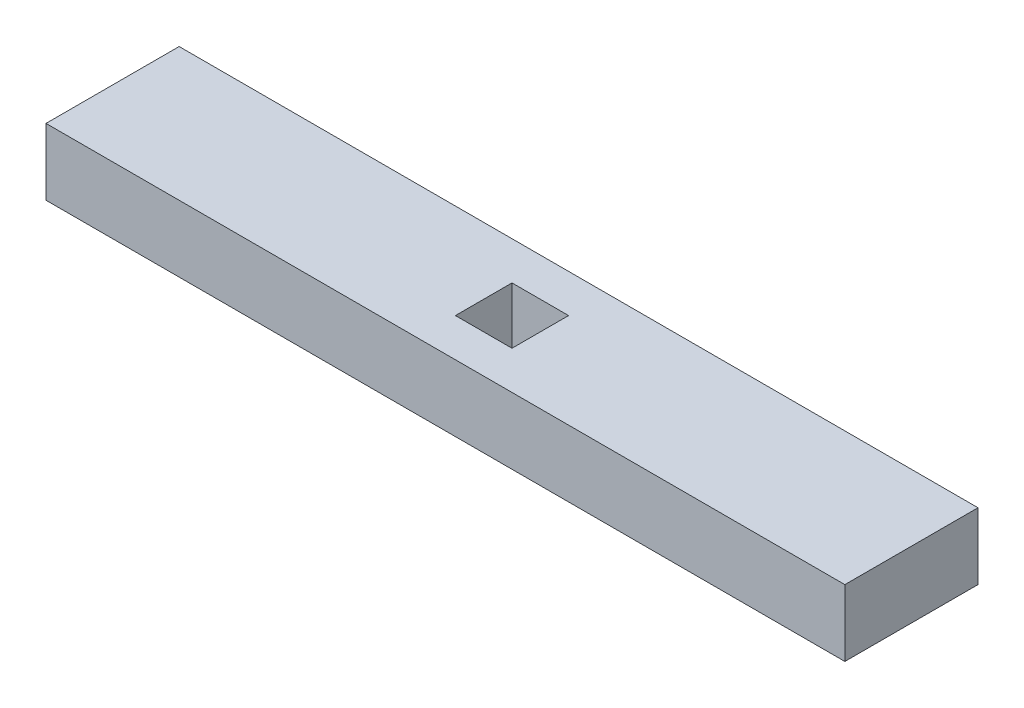
ISO-10303-21;
HEADER;
FILE_DESCRIPTION(('STEP AP214'),'2;1');
FILE_NAME('part.step','',(''),(''),'','','');
FILE_SCHEMA(('AUTOMOTIVE_DESIGN { 1 0 10303 214 1 1 1 1 }'));
ENDSEC;
DATA;
#1=APPLICATION_CONTEXT('core data for automotive mechanical design processes');
#2=APPLICATION_PROTOCOL_DEFINITION('international standard','automotive_design',2000,#1);
#3=PRODUCT_CONTEXT('',#1,'mechanical');
#4=PRODUCT('Part','Part','',(#3));
#5=PRODUCT_RELATED_PRODUCT_CATEGORY('part','',(#4));
#6=PRODUCT_DEFINITION_FORMATION('','',#4);
#7=PRODUCT_DEFINITION_CONTEXT('part definition',#1,'design');
#8=PRODUCT_DEFINITION('design','',#6,#7);
#9=PRODUCT_DEFINITION_SHAPE('','',#8);
#10=(LENGTH_UNIT() NAMED_UNIT(*) SI_UNIT(.MILLI.,.METRE.));
#11=(NAMED_UNIT(*) PLANE_ANGLE_UNIT() SI_UNIT($,.RADIAN.));
#12=(NAMED_UNIT(*) SI_UNIT($,.STERADIAN.) SOLID_ANGLE_UNIT());
#13=UNCERTAINTY_MEASURE_WITH_UNIT(LENGTH_MEASURE(1.E-05),#10,'distance_accuracy_value','');
#14=(GEOMETRIC_REPRESENTATION_CONTEXT(3) GLOBAL_UNCERTAINTY_ASSIGNED_CONTEXT((#13)) GLOBAL_UNIT_ASSIGNED_CONTEXT((#10,
#11,#12)) REPRESENTATION_CONTEXT('',''));
#15=CARTESIAN_POINT('',(0.,0.,0.));
#16=DIRECTION('',(0.,0.,1.));
#17=DIRECTION('',(1.,0.,0.));
#18=AXIS2_PLACEMENT_3D('',#15,#16,#17);
#19=CARTESIAN_POINT('',(0.,5.,0.));
#20=DIRECTION('',(0.,-1.,0.));
#21=DIRECTION('',(0.,0.,-1.));
#22=AXIS2_PLACEMENT_3D('',#19,#20,#21);
#23=PLANE('',#22);
#24=DIRECTION('',(0.,0.,1.));
#25=VECTOR('',#24,1.);
#26=CARTESIAN_POINT('',(-30.0000000000003,5.,-5.));
#27=LINE('',#26,#25);
#28=CARTESIAN_POINT('',(-30.0000000000003,5.,-5.));
#29=VERTEX_POINT('',#28);
#30=CARTESIAN_POINT('',(-30.0000000000003,5.,5.00000000000005));
#31=VERTEX_POINT('',#30);
#32=EDGE_CURVE('E136',#29,#31,#27,.T.);
#33=ORIENTED_EDGE('',*,*,#32,.T.);
#34=DIRECTION('',(1.,0.,0.));
#35=VECTOR('',#34,1.);
#36=CARTESIAN_POINT('',(30.,5.,5.00000000000005));
#37=LINE('',#36,#35);
#38=CARTESIAN_POINT('',(30.,5.,5.00000000000005));
#39=VERTEX_POINT('',#38);
#40=EDGE_CURVE('E139',#31,#39,#37,.T.);
#41=ORIENTED_EDGE('',*,*,#40,.T.);
#42=DIRECTION('',(0.,0.,-1.));
#43=VECTOR('',#42,1.);
#44=CARTESIAN_POINT('',(30.,5.,-5.));
#45=LINE('',#44,#43);
#46=CARTESIAN_POINT('',(30.,5.,-5.));
#47=VERTEX_POINT('',#46);
#48=EDGE_CURVE('E142',#39,#47,#45,.T.);
#49=ORIENTED_EDGE('',*,*,#48,.T.);
#50=DIRECTION('',(-1.,0.,0.));
#51=VECTOR('',#50,1.);
#52=CARTESIAN_POINT('',(30.,5.,-5.));
#53=LINE('',#52,#51);
#54=EDGE_CURVE('E144',#47,#29,#53,.T.);
#55=ORIENTED_EDGE('',*,*,#54,.T.);
#56=EDGE_LOOP('',(#33,#41,#49,#55));
#57=FACE_BOUND('',#56,.T.);
#58=DIRECTION('',(0.,0.,1.));
#59=VECTOR('',#58,1.);
#60=CARTESIAN_POINT('',(-2.125,5.,-2.125));
#61=LINE('',#60,#59);
#62=CARTESIAN_POINT('',(-2.125,5.,-2.125));
#63=VERTEX_POINT('',#62);
#64=CARTESIAN_POINT('',(-2.125,5.,2.125));
#65=VERTEX_POINT('',#64);
#66=EDGE_CURVE('E100',#63,#65,#61,.T.);
#67=ORIENTED_EDGE('',*,*,#66,.F.);
#68=DIRECTION('',(-1.,0.,0.));
#69=VECTOR('',#68,1.);
#70=CARTESIAN_POINT('',(2.125,5.,-2.125));
#71=LINE('',#70,#69);
#72=CARTESIAN_POINT('',(2.125,5.,-2.125));
#73=VERTEX_POINT('',#72);
#74=EDGE_CURVE('E122',#73,#63,#71,.T.);
#75=ORIENTED_EDGE('',*,*,#74,.F.);
#76=DIRECTION('',(0.,0.,-1.));
#77=VECTOR('',#76,1.);
#78=CARTESIAN_POINT('',(2.125,5.,-2.125));
#79=LINE('',#78,#77);
#80=CARTESIAN_POINT('',(2.125,5.,2.125));
#81=VERTEX_POINT('',#80);
#82=EDGE_CURVE('E120',#81,#73,#79,.T.);
#83=ORIENTED_EDGE('',*,*,#82,.F.);
#84=DIRECTION('',(1.,0.,0.));
#85=VECTOR('',#84,1.);
#86=CARTESIAN_POINT('',(2.125,5.,2.125));
#87=LINE('',#86,#85);
#88=EDGE_CURVE('E108',#65,#81,#87,.T.);
#89=ORIENTED_EDGE('',*,*,#88,.F.);
#90=EDGE_LOOP('',(#67,#75,#83,#89));
#91=FACE_BOUND('',#90,.T.);
#92=ADVANCED_FACE('F35',(#57,#91),#23,.F.);
#93=CARTESIAN_POINT('',(0.,0.,0.));
#94=DIRECTION('',(0.,-1.,0.));
#95=DIRECTION('',(0.,0.,-1.));
#96=AXIS2_PLACEMENT_3D('',#93,#94,#95);
#97=PLANE('',#96);
#98=DIRECTION('',(0.,0.,1.));
#99=VECTOR('',#98,1.);
#100=CARTESIAN_POINT('',(-30.0000000000003,0.,-5.));
#101=LINE('',#100,#99);
#102=CARTESIAN_POINT('',(-30.0000000000003,0.,-5.));
#103=VERTEX_POINT('',#102);
#104=CARTESIAN_POINT('',(-30.0000000000003,0.,5.00000000000005));
#105=VERTEX_POINT('',#104);
#106=EDGE_CURVE('E116',#103,#105,#101,.T.);
#107=ORIENTED_EDGE('',*,*,#106,.F.);
#108=DIRECTION('',(-1.,0.,0.));
#109=VECTOR('',#108,1.);
#110=CARTESIAN_POINT('',(30.,0.,-5.));
#111=LINE('',#110,#109);
#112=CARTESIAN_POINT('',(30.,0.,-5.));
#113=VERTEX_POINT('',#112);
#114=EDGE_CURVE('E140',#113,#103,#111,.T.);
#115=ORIENTED_EDGE('',*,*,#114,.F.);
#116=DIRECTION('',(0.,0.,-1.));
#117=VECTOR('',#116,1.);
#118=CARTESIAN_POINT('',(30.,0.,-5.));
#119=LINE('',#118,#117);
#120=CARTESIAN_POINT('',(30.,0.,5.00000000000005));
#121=VERTEX_POINT('',#120);
#122=EDGE_CURVE('E151',#121,#113,#119,.T.);
#123=ORIENTED_EDGE('',*,*,#122,.F.);
#124=DIRECTION('',(1.,0.,0.));
#125=VECTOR('',#124,1.);
#126=CARTESIAN_POINT('',(30.,0.,5.00000000000005));
#127=LINE('',#126,#125);
#128=EDGE_CURVE('E149',#105,#121,#127,.T.);
#129=ORIENTED_EDGE('',*,*,#128,.F.);
#130=EDGE_LOOP('',(#107,#115,#123,#129));
#131=FACE_BOUND('',#130,.T.);
#132=DIRECTION('',(-1.,0.,0.));
#133=VECTOR('',#132,1.);
#134=CARTESIAN_POINT('',(2.125,0.,-2.125));
#135=LINE('',#134,#133);
#136=CARTESIAN_POINT('',(2.125,0.,-2.125));
#137=VERTEX_POINT('',#136);
#138=CARTESIAN_POINT('',(-2.125,0.,-2.125));
#139=VERTEX_POINT('',#138);
#140=EDGE_CURVE('E109',#137,#139,#135,.T.);
#141=ORIENTED_EDGE('',*,*,#140,.T.);
#142=DIRECTION('',(0.,0.,1.));
#143=VECTOR('',#142,1.);
#144=CARTESIAN_POINT('',(-2.125,0.,-2.125));
#145=LINE('',#144,#143);
#146=CARTESIAN_POINT('',(-2.125,0.,2.125));
#147=VERTEX_POINT('',#146);
#148=EDGE_CURVE('E58',#139,#147,#145,.T.);
#149=ORIENTED_EDGE('',*,*,#148,.T.);
#150=DIRECTION('',(1.,0.,0.));
#151=VECTOR('',#150,1.);
#152=CARTESIAN_POINT('',(2.125,0.,2.125));
#153=LINE('',#152,#151);
#154=CARTESIAN_POINT('',(2.125,0.,2.125));
#155=VERTEX_POINT('',#154);
#156=EDGE_CURVE('E115',#147,#155,#153,.T.);
#157=ORIENTED_EDGE('',*,*,#156,.T.);
#158=DIRECTION('',(0.,0.,-1.));
#159=VECTOR('',#158,1.);
#160=CARTESIAN_POINT('',(2.125,0.,-2.125));
#161=LINE('',#160,#159);
#162=EDGE_CURVE('E128',#155,#137,#161,.T.);
#163=ORIENTED_EDGE('',*,*,#162,.T.);
#164=EDGE_LOOP('',(#141,#149,#157,#163));
#165=FACE_BOUND('',#164,.T.);
#166=ADVANCED_FACE('F169',(#131,#165),#97,.T.);
#167=CARTESIAN_POINT('',(-30.0000000000003,5.,-5.));
#168=DIRECTION('',(1.,0.,0.));
#169=DIRECTION('',(0.,0.,-1.));
#170=AXIS2_PLACEMENT_3D('',#167,#168,#169);
#171=PLANE('',#170);
#172=ORIENTED_EDGE('',*,*,#106,.T.);
#173=DIRECTION('',(0.,-1.,0.));
#174=VECTOR('',#173,1.);
#175=CARTESIAN_POINT('',(-30.0000000000003,5.,5.00000000000005));
#176=LINE('',#175,#174);
#177=EDGE_CURVE('E11',#31,#105,#176,.T.);
#178=ORIENTED_EDGE('',*,*,#177,.F.);
#179=ORIENTED_EDGE('',*,*,#32,.F.);
#180=DIRECTION('',(0.,-1.,0.));
#181=VECTOR('',#180,1.);
#182=CARTESIAN_POINT('',(-30.0000000000003,5.,-5.));
#183=LINE('',#182,#181);
#184=EDGE_CURVE('E146',#29,#103,#183,.T.);
#185=ORIENTED_EDGE('',*,*,#184,.T.);
#186=EDGE_LOOP('',(#172,#178,#179,#185));
#187=FACE_BOUND('',#186,.T.);
#188=ADVANCED_FACE('F37',(#187),#171,.F.);
#189=CARTESIAN_POINT('',(30.,5.,5.00000000000005));
#190=DIRECTION('',(0.,0.,-1.));
#191=DIRECTION('',(-1.,0.,0.));
#192=AXIS2_PLACEMENT_3D('',#189,#190,#191);
#193=PLANE('',#192);
#194=ORIENTED_EDGE('',*,*,#128,.T.);
#195=DIRECTION('',(0.,-1.,0.));
#196=VECTOR('',#195,1.);
#197=CARTESIAN_POINT('',(30.,5.,5.00000000000005));
#198=LINE('',#197,#196);
#199=EDGE_CURVE('E43',#39,#121,#198,.T.);
#200=ORIENTED_EDGE('',*,*,#199,.F.);
#201=ORIENTED_EDGE('',*,*,#40,.F.);
#202=ORIENTED_EDGE('',*,*,#177,.T.);
#203=EDGE_LOOP('',(#194,#200,#201,#202));
#204=FACE_BOUND('',#203,.T.);
#205=ADVANCED_FACE('F179',(#204),#193,.F.);
#206=CARTESIAN_POINT('',(30.,5.,-5.));
#207=DIRECTION('',(-1.,0.,0.));
#208=DIRECTION('',(0.,0.,1.));
#209=AXIS2_PLACEMENT_3D('',#206,#207,#208);
#210=PLANE('',#209);
#211=ORIENTED_EDGE('',*,*,#122,.T.);
#212=DIRECTION('',(0.,-1.,0.));
#213=VECTOR('',#212,1.);
#214=CARTESIAN_POINT('',(30.,5.,-5.));
#215=LINE('',#214,#213);
#216=EDGE_CURVE('E156',#47,#113,#215,.T.);
#217=ORIENTED_EDGE('',*,*,#216,.F.);
#218=ORIENTED_EDGE('',*,*,#48,.F.);
#219=ORIENTED_EDGE('',*,*,#199,.T.);
#220=EDGE_LOOP('',(#211,#217,#218,#219));
#221=FACE_BOUND('',#220,.T.);
#222=ADVANCED_FACE('F163',(#221),#210,.F.);
#223=CARTESIAN_POINT('',(30.,5.,-5.));
#224=DIRECTION('',(0.,0.,1.));
#225=DIRECTION('',(1.,0.,0.));
#226=AXIS2_PLACEMENT_3D('',#223,#224,#225);
#227=PLANE('',#226);
#228=ORIENTED_EDGE('',*,*,#114,.T.);
#229=ORIENTED_EDGE('',*,*,#184,.F.);
#230=ORIENTED_EDGE('',*,*,#54,.F.);
#231=ORIENTED_EDGE('',*,*,#216,.T.);
#232=EDGE_LOOP('',(#228,#229,#230,#231));
#233=FACE_BOUND('',#232,.T.);
#234=ADVANCED_FACE('F173',(#233),#227,.F.);
#235=CARTESIAN_POINT('',(-2.125,5.,-2.125));
#236=DIRECTION('',(1.,0.,0.));
#237=DIRECTION('',(0.,0.,-1.));
#238=AXIS2_PLACEMENT_3D('',#235,#236,#237);
#239=PLANE('',#238);
#240=ORIENTED_EDGE('',*,*,#148,.F.);
#241=DIRECTION('',(0.,-1.,0.));
#242=VECTOR('',#241,1.);
#243=CARTESIAN_POINT('',(-2.125,5.,-2.125));
#244=LINE('',#243,#242);
#245=EDGE_CURVE('E104',#63,#139,#244,.T.);
#246=ORIENTED_EDGE('',*,*,#245,.F.);
#247=ORIENTED_EDGE('',*,*,#66,.T.);
#248=DIRECTION('',(0.,-1.,0.));
#249=VECTOR('',#248,1.);
#250=CARTESIAN_POINT('',(-2.125,5.,2.125));
#251=LINE('',#250,#249);
#252=EDGE_CURVE('E103',#65,#147,#251,.T.);
#253=ORIENTED_EDGE('',*,*,#252,.T.);
#254=EDGE_LOOP('',(#240,#246,#247,#253));
#255=FACE_BOUND('',#254,.T.);
#256=ADVANCED_FACE('F102',(#255),#239,.T.);
#257=CARTESIAN_POINT('',(2.125,5.,2.125));
#258=DIRECTION('',(0.,0.,-1.));
#259=DIRECTION('',(-1.,0.,0.));
#260=AXIS2_PLACEMENT_3D('',#257,#258,#259);
#261=PLANE('',#260);
#262=ORIENTED_EDGE('',*,*,#156,.F.);
#263=ORIENTED_EDGE('',*,*,#252,.F.);
#264=ORIENTED_EDGE('',*,*,#88,.T.);
#265=DIRECTION('',(0.,-1.,0.));
#266=VECTOR('',#265,1.);
#267=CARTESIAN_POINT('',(2.125,5.,2.125));
#268=LINE('',#267,#266);
#269=EDGE_CURVE('E117',#81,#155,#268,.T.);
#270=ORIENTED_EDGE('',*,*,#269,.T.);
#271=EDGE_LOOP('',(#262,#263,#264,#270));
#272=FACE_BOUND('',#271,.T.);
#273=ADVANCED_FACE('F112',(#272),#261,.T.);
#274=CARTESIAN_POINT('',(2.125,5.,-2.125));
#275=DIRECTION('',(-1.,0.,0.));
#276=DIRECTION('',(0.,0.,1.));
#277=AXIS2_PLACEMENT_3D('',#274,#275,#276);
#278=PLANE('',#277);
#279=ORIENTED_EDGE('',*,*,#162,.F.);
#280=ORIENTED_EDGE('',*,*,#269,.F.);
#281=ORIENTED_EDGE('',*,*,#82,.T.);
#282=DIRECTION('',(0.,-1.,0.));
#283=VECTOR('',#282,1.);
#284=CARTESIAN_POINT('',(2.125,5.,-2.125));
#285=LINE('',#284,#283);
#286=EDGE_CURVE('E50',#73,#137,#285,.T.);
#287=ORIENTED_EDGE('',*,*,#286,.T.);
#288=EDGE_LOOP('',(#279,#280,#281,#287));
#289=FACE_BOUND('',#288,.T.);
#290=ADVANCED_FACE('F202',(#289),#278,.T.);
#291=CARTESIAN_POINT('',(2.125,5.,-2.125));
#292=DIRECTION('',(0.,0.,1.));
#293=DIRECTION('',(1.,0.,0.));
#294=AXIS2_PLACEMENT_3D('',#291,#292,#293);
#295=PLANE('',#294);
#296=ORIENTED_EDGE('',*,*,#140,.F.);
#297=ORIENTED_EDGE('',*,*,#286,.F.);
#298=ORIENTED_EDGE('',*,*,#74,.T.);
#299=ORIENTED_EDGE('',*,*,#245,.T.);
#300=EDGE_LOOP('',(#296,#297,#298,#299));
#301=FACE_BOUND('',#300,.T.);
#302=ADVANCED_FACE('F206',(#301),#295,.T.);
#303=CLOSED_SHELL('',(#92,#166,#188,#205,#222,#234,#256,#273,#290,#302));
#304=MANIFOLD_SOLID_BREP('B2',#303);
#305=ADVANCED_BREP_SHAPE_REPRESENTATION('',(#18,#304),#14);
#306=SHAPE_DEFINITION_REPRESENTATION(#9,#305);
ENDSEC;
END-ISO-10303-21;
